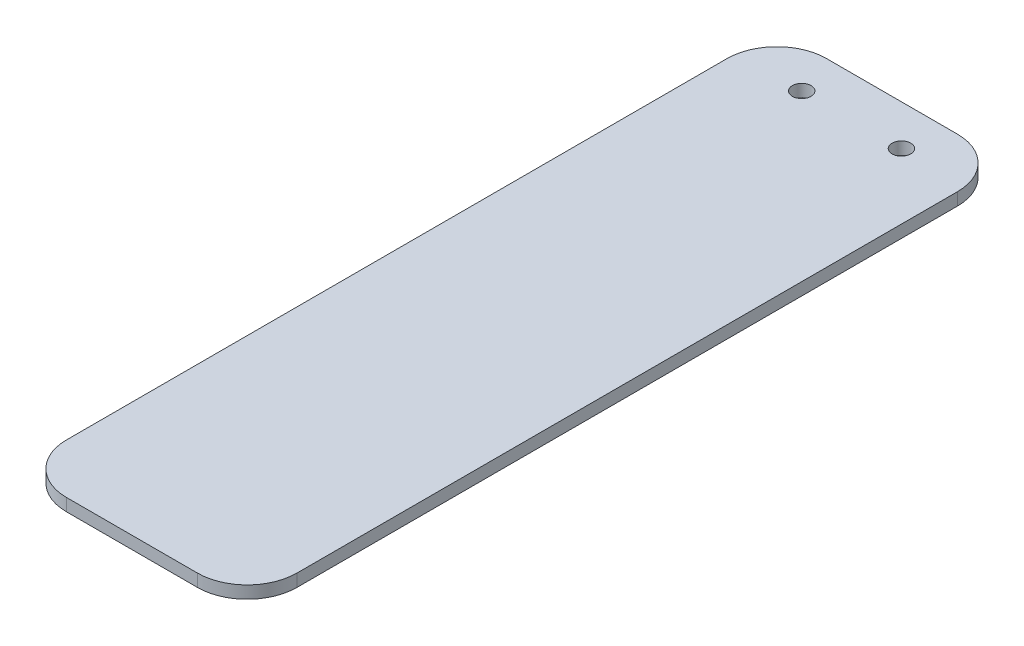
ISO-10303-21;
HEADER;
FILE_DESCRIPTION(('STEP AP214'),'2;1');
FILE_NAME('part.step','',(''),(''),'','','');
FILE_SCHEMA(('AUTOMOTIVE_DESIGN { 1 0 10303 214 1 1 1 1 }'));
ENDSEC;
DATA;
#1=APPLICATION_CONTEXT('core data for automotive mechanical design processes');
#2=APPLICATION_PROTOCOL_DEFINITION('international standard','automotive_design',2000,#1);
#3=PRODUCT_CONTEXT('',#1,'mechanical');
#4=PRODUCT('Part','Part','',(#3));
#5=PRODUCT_RELATED_PRODUCT_CATEGORY('part','',(#4));
#6=PRODUCT_DEFINITION_FORMATION('','',#4);
#7=PRODUCT_DEFINITION_CONTEXT('part definition',#1,'design');
#8=PRODUCT_DEFINITION('design','',#6,#7);
#9=PRODUCT_DEFINITION_SHAPE('','',#8);
#10=(LENGTH_UNIT() NAMED_UNIT(*) SI_UNIT(.MILLI.,.METRE.));
#11=(NAMED_UNIT(*) PLANE_ANGLE_UNIT() SI_UNIT($,.RADIAN.));
#12=(NAMED_UNIT(*) SI_UNIT($,.STERADIAN.) SOLID_ANGLE_UNIT());
#13=UNCERTAINTY_MEASURE_WITH_UNIT(LENGTH_MEASURE(1.E-05),#10,'distance_accuracy_value','');
#14=(GEOMETRIC_REPRESENTATION_CONTEXT(3) GLOBAL_UNCERTAINTY_ASSIGNED_CONTEXT((#13)) GLOBAL_UNIT_ASSIGNED_CONTEXT((#10,
#11,#12)) REPRESENTATION_CONTEXT('',''));
#15=CARTESIAN_POINT('',(0.,0.,0.));
#16=DIRECTION('',(0.,0.,1.));
#17=DIRECTION('',(1.,0.,0.));
#18=AXIS2_PLACEMENT_3D('',#15,#16,#17);
#19=CARTESIAN_POINT('',(8.,2.,-8.));
#20=DIRECTION('',(0.,-1.,0.));
#21=DIRECTION('',(0.,0.,-1.));
#22=AXIS2_PLACEMENT_3D('',#19,#20,#21);
#23=PLANE('',#22);
#24=CARTESIAN_POINT('',(8.,2.,-8.));
#25=DIRECTION('',(0.,1.,0.));
#26=DIRECTION('',(0.,0.,-1.));
#27=AXIS2_PLACEMENT_3D('',#24,#25,#26);
#28=CIRCLE('',#27,8.);
#29=CARTESIAN_POINT('',(0.,2.,-8.00000000000006));
#30=VERTEX_POINT('',#29);
#31=CARTESIAN_POINT('',(8.00000000000006,2.,0.));
#32=VERTEX_POINT('',#31);
#33=EDGE_CURVE('E170',#30,#32,#28,.T.);
#34=ORIENTED_EDGE('',*,*,#33,.T.);
#35=DIRECTION('',(1.,0.,0.));
#36=VECTOR('',#35,1.);
#37=CARTESIAN_POINT('',(8.00000000000006,2.,0.));
#38=LINE('',#37,#36);
#39=CARTESIAN_POINT('',(28.9999999999999,2.,0.));
#40=VERTEX_POINT('',#39);
#41=EDGE_CURVE('E106',#32,#40,#38,.T.);
#42=ORIENTED_EDGE('',*,*,#41,.T.);
#43=CARTESIAN_POINT('',(29.,2.,-8.));
#44=DIRECTION('',(0.,1.,0.));
#45=DIRECTION('',(0.,0.,1.));
#46=AXIS2_PLACEMENT_3D('',#43,#44,#45);
#47=CIRCLE('',#46,8.);
#48=CARTESIAN_POINT('',(37.,2.,-8.00000000000005));
#49=VERTEX_POINT('',#48);
#50=EDGE_CURVE('E191',#40,#49,#47,.T.);
#51=ORIENTED_EDGE('',*,*,#50,.T.);
#52=DIRECTION('',(0.,0.,-1.));
#53=VECTOR('',#52,1.);
#54=CARTESIAN_POINT('',(37.,2.,-8.00000000000006));
#55=LINE('',#54,#53);
#56=CARTESIAN_POINT('',(37.,2.,-114.));
#57=VERTEX_POINT('',#56);
#58=EDGE_CURVE('E205',#49,#57,#55,.T.);
#59=ORIENTED_EDGE('',*,*,#58,.T.);
#60=CARTESIAN_POINT('',(29.,2.,-114.));
#61=DIRECTION('',(0.,1.,0.));
#62=DIRECTION('',(0.,0.,-1.));
#63=AXIS2_PLACEMENT_3D('',#60,#61,#62);
#64=CIRCLE('',#63,8.);
#65=CARTESIAN_POINT('',(28.9999999999999,2.,-122.));
#66=VERTEX_POINT('',#65);
#67=EDGE_CURVE('E125',#57,#66,#64,.T.);
#68=ORIENTED_EDGE('',*,*,#67,.T.);
#69=DIRECTION('',(-1.,0.,0.));
#70=VECTOR('',#69,1.);
#71=CARTESIAN_POINT('',(8.00000000000006,2.,-122.));
#72=LINE('',#71,#70);
#73=CARTESIAN_POINT('',(8.00000000000006,2.,-122.));
#74=VERTEX_POINT('',#73);
#75=EDGE_CURVE('E119',#66,#74,#72,.T.);
#76=ORIENTED_EDGE('',*,*,#75,.T.);
#77=CARTESIAN_POINT('',(8.,2.,-114.));
#78=DIRECTION('',(0.,1.,0.));
#79=DIRECTION('',(0.,0.,-1.));
#80=AXIS2_PLACEMENT_3D('',#77,#78,#79);
#81=CIRCLE('',#80,8.);
#82=CARTESIAN_POINT('',(0.,2.,-114.));
#83=VERTEX_POINT('',#82);
#84=EDGE_CURVE('E123',#74,#83,#81,.T.);
#85=ORIENTED_EDGE('',*,*,#84,.T.);
#86=DIRECTION('',(0.,0.,1.));
#87=VECTOR('',#86,1.);
#88=CARTESIAN_POINT('',(0.,2.,-8.00000000000006));
#89=LINE('',#88,#87);
#90=EDGE_CURVE('E63',#83,#30,#89,.T.);
#91=ORIENTED_EDGE('',*,*,#90,.T.);
#92=EDGE_LOOP('',(#34,#42,#51,#59,#68,#76,#85,#91));
#93=FACE_BOUND('',#92,.T.);
#94=CARTESIAN_POINT('',(26.5,2.,-115.5));
#95=DIRECTION('',(0.,1.,0.));
#96=DIRECTION('',(0.,0.,1.));
#97=AXIS2_PLACEMENT_3D('',#94,#95,#96);
#98=CIRCLE('',#97,1.5);
#99=CARTESIAN_POINT('',(26.5,2.,-114.));
#100=VERTEX_POINT('',#99);
#101=EDGE_CURVE('E152',#100,#100,#98,.T.);
#102=ORIENTED_EDGE('',*,*,#101,.F.);
#103=EDGE_LOOP('',(#102));
#104=FACE_BOUND('',#103,.T.);
#105=CARTESIAN_POINT('',(10.5,2.,-115.5));
#106=DIRECTION('',(0.,1.,0.));
#107=DIRECTION('',(0.,0.,-1.));
#108=AXIS2_PLACEMENT_3D('',#105,#106,#107);
#109=CIRCLE('',#108,1.5);
#110=CARTESIAN_POINT('',(10.5,2.,-117.));
#111=VERTEX_POINT('',#110);
#112=EDGE_CURVE('E219',#111,#111,#109,.T.);
#113=ORIENTED_EDGE('',*,*,#112,.F.);
#114=EDGE_LOOP('',(#113));
#115=FACE_BOUND('',#114,.T.);
#116=ADVANCED_FACE('F45',(#93,#104,#115),#23,.F.);
#117=CARTESIAN_POINT('',(8.,0.,-8.));
#118=DIRECTION('',(0.,-1.,0.));
#119=DIRECTION('',(0.,0.,-1.));
#120=AXIS2_PLACEMENT_3D('',#117,#118,#119);
#121=PLANE('',#120);
#122=CARTESIAN_POINT('',(26.5,0.,-115.5));
#123=DIRECTION('',(0.,1.,0.));
#124=DIRECTION('',(0.,0.,1.));
#125=AXIS2_PLACEMENT_3D('',#122,#123,#124);
#126=CIRCLE('',#125,1.5);
#127=CARTESIAN_POINT('',(26.5,0.,-114.));
#128=VERTEX_POINT('',#127);
#129=EDGE_CURVE('E215',#128,#128,#126,.T.);
#130=ORIENTED_EDGE('',*,*,#129,.T.);
#131=EDGE_LOOP('',(#130));
#132=FACE_BOUND('',#131,.T.);
#133=CARTESIAN_POINT('',(8.,0.,-8.));
#134=DIRECTION('',(0.,1.,0.));
#135=DIRECTION('',(0.,0.,-1.));
#136=AXIS2_PLACEMENT_3D('',#133,#134,#135);
#137=CIRCLE('',#136,8.);
#138=CARTESIAN_POINT('',(0.,0.,-8.00000000000006));
#139=VERTEX_POINT('',#138);
#140=CARTESIAN_POINT('',(8.00000000000006,0.,0.));
#141=VERTEX_POINT('',#140);
#142=EDGE_CURVE('E147',#139,#141,#137,.T.);
#143=ORIENTED_EDGE('',*,*,#142,.F.);
#144=DIRECTION('',(0.,0.,1.));
#145=VECTOR('',#144,1.);
#146=CARTESIAN_POINT('',(0.,0.,-8.00000000000006));
#147=LINE('',#146,#145);
#148=CARTESIAN_POINT('',(0.,0.,-114.));
#149=VERTEX_POINT('',#148);
#150=EDGE_CURVE('E98',#149,#139,#147,.T.);
#151=ORIENTED_EDGE('',*,*,#150,.F.);
#152=CARTESIAN_POINT('',(8.,0.,-114.));
#153=DIRECTION('',(0.,1.,0.));
#154=DIRECTION('',(0.,0.,-1.));
#155=AXIS2_PLACEMENT_3D('',#152,#153,#154);
#156=CIRCLE('',#155,8.);
#157=CARTESIAN_POINT('',(8.00000000000006,0.,-122.));
#158=VERTEX_POINT('',#157);
#159=EDGE_CURVE('E92',#158,#149,#156,.T.);
#160=ORIENTED_EDGE('',*,*,#159,.F.);
#161=DIRECTION('',(-1.,0.,0.));
#162=VECTOR('',#161,1.);
#163=CARTESIAN_POINT('',(8.00000000000006,0.,-122.));
#164=LINE('',#163,#162);
#165=CARTESIAN_POINT('',(28.9999999999999,0.,-122.));
#166=VERTEX_POINT('',#165);
#167=EDGE_CURVE('E134',#166,#158,#164,.T.);
#168=ORIENTED_EDGE('',*,*,#167,.F.);
#169=CARTESIAN_POINT('',(29.,0.,-114.));
#170=DIRECTION('',(0.,1.,0.));
#171=DIRECTION('',(0.,0.,-1.));
#172=AXIS2_PLACEMENT_3D('',#169,#170,#171);
#173=CIRCLE('',#172,8.);
#174=CARTESIAN_POINT('',(37.,0.,-114.));
#175=VERTEX_POINT('',#174);
#176=EDGE_CURVE('E161',#175,#166,#173,.T.);
#177=ORIENTED_EDGE('',*,*,#176,.F.);
#178=DIRECTION('',(0.,0.,-1.));
#179=VECTOR('',#178,1.);
#180=CARTESIAN_POINT('',(37.,0.,-8.00000000000006));
#181=LINE('',#180,#179);
#182=CARTESIAN_POINT('',(37.,0.,-8.00000000000005));
#183=VERTEX_POINT('',#182);
#184=EDGE_CURVE('E158',#183,#175,#181,.T.);
#185=ORIENTED_EDGE('',*,*,#184,.F.);
#186=CARTESIAN_POINT('',(29.,0.,-8.));
#187=DIRECTION('',(0.,1.,0.));
#188=DIRECTION('',(0.,0.,1.));
#189=AXIS2_PLACEMENT_3D('',#186,#187,#188);
#190=CIRCLE('',#189,8.);
#191=CARTESIAN_POINT('',(28.9999999999999,0.,0.));
#192=VERTEX_POINT('',#191);
#193=EDGE_CURVE('E155',#192,#183,#190,.T.);
#194=ORIENTED_EDGE('',*,*,#193,.F.);
#195=DIRECTION('',(1.,0.,0.));
#196=VECTOR('',#195,1.);
#197=CARTESIAN_POINT('',(8.00000000000006,0.,0.));
#198=LINE('',#197,#196);
#199=EDGE_CURVE('E151',#141,#192,#198,.T.);
#200=ORIENTED_EDGE('',*,*,#199,.F.);
#201=EDGE_LOOP('',(#143,#151,#160,#168,#177,#185,#194,#200));
#202=FACE_BOUND('',#201,.T.);
#203=CARTESIAN_POINT('',(10.5,0.,-115.5));
#204=DIRECTION('',(0.,1.,0.));
#205=DIRECTION('',(0.,0.,-1.));
#206=AXIS2_PLACEMENT_3D('',#203,#204,#205);
#207=CIRCLE('',#206,1.5);
#208=CARTESIAN_POINT('',(10.5,0.,-117.));
#209=VERTEX_POINT('',#208);
#210=EDGE_CURVE('E223',#209,#209,#207,.T.);
#211=ORIENTED_EDGE('',*,*,#210,.T.);
#212=EDGE_LOOP('',(#211));
#213=FACE_BOUND('',#212,.T.);
#214=ADVANCED_FACE('F195',(#132,#202,#213),#121,.T.);
#215=CARTESIAN_POINT('',(8.,2.,-8.));
#216=DIRECTION('',(0.,-1.,0.));
#217=DIRECTION('',(0.,0.,-1.));
#218=AXIS2_PLACEMENT_3D('',#215,#216,#217);
#219=CYLINDRICAL_SURFACE('',#218,8.);
#220=ORIENTED_EDGE('',*,*,#142,.T.);
#221=DIRECTION('',(0.,-1.,0.));
#222=VECTOR('',#221,1.);
#223=CARTESIAN_POINT('',(8.00000000000006,2.,0.));
#224=LINE('',#223,#222);
#225=EDGE_CURVE('E11',#32,#141,#224,.T.);
#226=ORIENTED_EDGE('',*,*,#225,.F.);
#227=ORIENTED_EDGE('',*,*,#33,.F.);
#228=DIRECTION('',(0.,-1.,0.));
#229=VECTOR('',#228,1.);
#230=CARTESIAN_POINT('',(0.,2.,-8.00000000000006));
#231=LINE('',#230,#229);
#232=EDGE_CURVE('E143',#30,#139,#231,.T.);
#233=ORIENTED_EDGE('',*,*,#232,.T.);
#234=EDGE_LOOP('',(#220,#226,#227,#233));
#235=FACE_BOUND('',#234,.T.);
#236=ADVANCED_FACE('F47',(#235),#219,.T.);
#237=CARTESIAN_POINT('',(8.00000000000006,2.,0.));
#238=DIRECTION('',(0.,0.,-1.));
#239=DIRECTION('',(-1.,0.,0.));
#240=AXIS2_PLACEMENT_3D('',#237,#238,#239);
#241=PLANE('',#240);
#242=ORIENTED_EDGE('',*,*,#199,.T.);
#243=DIRECTION('',(0.,-1.,0.));
#244=VECTOR('',#243,1.);
#245=CARTESIAN_POINT('',(28.9999999999999,2.,0.));
#246=LINE('',#245,#244);
#247=EDGE_CURVE('E55',#40,#192,#246,.T.);
#248=ORIENTED_EDGE('',*,*,#247,.F.);
#249=ORIENTED_EDGE('',*,*,#41,.F.);
#250=ORIENTED_EDGE('',*,*,#225,.T.);
#251=EDGE_LOOP('',(#242,#248,#249,#250));
#252=FACE_BOUND('',#251,.T.);
#253=ADVANCED_FACE('F257',(#252),#241,.F.);
#254=CARTESIAN_POINT('',(29.,2.,-8.));
#255=DIRECTION('',(0.,-1.,0.));
#256=DIRECTION('',(0.,0.,-1.));
#257=AXIS2_PLACEMENT_3D('',#254,#255,#256);
#258=CYLINDRICAL_SURFACE('',#257,8.);
#259=ORIENTED_EDGE('',*,*,#193,.T.);
#260=DIRECTION('',(0.,-1.,0.));
#261=VECTOR('',#260,1.);
#262=CARTESIAN_POINT('',(37.,2.,-8.00000000000005));
#263=LINE('',#262,#261);
#264=EDGE_CURVE('E181',#49,#183,#263,.T.);
#265=ORIENTED_EDGE('',*,*,#264,.F.);
#266=ORIENTED_EDGE('',*,*,#50,.F.);
#267=ORIENTED_EDGE('',*,*,#247,.T.);
#268=EDGE_LOOP('',(#259,#265,#266,#267));
#269=FACE_BOUND('',#268,.T.);
#270=ADVANCED_FACE('F189',(#269),#258,.T.);
#271=CARTESIAN_POINT('',(37.,2.,-8.00000000000006));
#272=DIRECTION('',(-1.,0.,0.));
#273=DIRECTION('',(0.,0.,1.));
#274=AXIS2_PLACEMENT_3D('',#271,#272,#273);
#275=PLANE('',#274);
#276=ORIENTED_EDGE('',*,*,#184,.T.);
#277=DIRECTION('',(0.,-1.,0.));
#278=VECTOR('',#277,1.);
#279=CARTESIAN_POINT('',(37.,2.,-114.));
#280=LINE('',#279,#278);
#281=EDGE_CURVE('E177',#57,#175,#280,.T.);
#282=ORIENTED_EDGE('',*,*,#281,.F.);
#283=ORIENTED_EDGE('',*,*,#58,.F.);
#284=ORIENTED_EDGE('',*,*,#264,.T.);
#285=EDGE_LOOP('',(#276,#282,#283,#284));
#286=FACE_BOUND('',#285,.T.);
#287=ADVANCED_FACE('F200',(#286),#275,.F.);
#288=CARTESIAN_POINT('',(29.,2.,-114.));
#289=DIRECTION('',(0.,-1.,0.));
#290=DIRECTION('',(0.,0.,-1.));
#291=AXIS2_PLACEMENT_3D('',#288,#289,#290);
#292=CYLINDRICAL_SURFACE('',#291,8.);
#293=ORIENTED_EDGE('',*,*,#176,.T.);
#294=DIRECTION('',(0.,-1.,0.));
#295=VECTOR('',#294,1.);
#296=CARTESIAN_POINT('',(28.9999999999999,2.,-122.));
#297=LINE('',#296,#295);
#298=EDGE_CURVE('E136',#66,#166,#297,.T.);
#299=ORIENTED_EDGE('',*,*,#298,.F.);
#300=ORIENTED_EDGE('',*,*,#67,.F.);
#301=ORIENTED_EDGE('',*,*,#281,.T.);
#302=EDGE_LOOP('',(#293,#299,#300,#301));
#303=FACE_BOUND('',#302,.T.);
#304=ADVANCED_FACE('F203',(#303),#292,.T.);
#305=CARTESIAN_POINT('',(8.00000000000006,2.,-122.));
#306=DIRECTION('',(0.,0.,1.));
#307=DIRECTION('',(1.,0.,0.));
#308=AXIS2_PLACEMENT_3D('',#305,#306,#307);
#309=PLANE('',#308);
#310=ORIENTED_EDGE('',*,*,#167,.T.);
#311=DIRECTION('',(0.,-1.,0.));
#312=VECTOR('',#311,1.);
#313=CARTESIAN_POINT('',(8.00000000000006,2.,-122.));
#314=LINE('',#313,#312);
#315=EDGE_CURVE('E131',#74,#158,#314,.T.);
#316=ORIENTED_EDGE('',*,*,#315,.F.);
#317=ORIENTED_EDGE('',*,*,#75,.F.);
#318=ORIENTED_EDGE('',*,*,#298,.T.);
#319=EDGE_LOOP('',(#310,#316,#317,#318));
#320=FACE_BOUND('',#319,.T.);
#321=ADVANCED_FACE('F132',(#320),#309,.F.);
#322=CARTESIAN_POINT('',(8.,2.,-114.));
#323=DIRECTION('',(0.,-1.,0.));
#324=DIRECTION('',(0.,0.,-1.));
#325=AXIS2_PLACEMENT_3D('',#322,#323,#324);
#326=CYLINDRICAL_SURFACE('',#325,8.);
#327=ORIENTED_EDGE('',*,*,#159,.T.);
#328=DIRECTION('',(0.,-1.,0.));
#329=VECTOR('',#328,1.);
#330=CARTESIAN_POINT('',(0.,2.,-114.));
#331=LINE('',#330,#329);
#332=EDGE_CURVE('E137',#83,#149,#331,.T.);
#333=ORIENTED_EDGE('',*,*,#332,.F.);
#334=ORIENTED_EDGE('',*,*,#84,.F.);
#335=ORIENTED_EDGE('',*,*,#315,.T.);
#336=EDGE_LOOP('',(#327,#333,#334,#335));
#337=FACE_BOUND('',#336,.T.);
#338=ADVANCED_FACE('F139',(#337),#326,.T.);
#339=CARTESIAN_POINT('',(0.,2.,-8.00000000000006));
#340=DIRECTION('',(1.,0.,0.));
#341=DIRECTION('',(0.,0.,-1.));
#342=AXIS2_PLACEMENT_3D('',#339,#340,#341);
#343=PLANE('',#342);
#344=ORIENTED_EDGE('',*,*,#150,.T.);
#345=ORIENTED_EDGE('',*,*,#232,.F.);
#346=ORIENTED_EDGE('',*,*,#90,.F.);
#347=ORIENTED_EDGE('',*,*,#332,.T.);
#348=EDGE_LOOP('',(#344,#345,#346,#347));
#349=FACE_BOUND('',#348,.T.);
#350=ADVANCED_FACE('F245',(#349),#343,.F.);
#351=CARTESIAN_POINT('',(26.5,2.,-115.5));
#352=DIRECTION('',(0.,-1.,0.));
#353=DIRECTION('',(0.,0.,-1.));
#354=AXIS2_PLACEMENT_3D('',#351,#352,#353);
#355=CYLINDRICAL_SURFACE('',#354,1.5);
#356=ORIENTED_EDGE('',*,*,#101,.T.);
#357=EDGE_LOOP('',(#356));
#358=FACE_BOUND('',#357,.T.);
#359=ORIENTED_EDGE('',*,*,#129,.F.);
#360=EDGE_LOOP('',(#359));
#361=FACE_BOUND('',#360,.T.);
#362=ADVANCED_FACE('F242',(#358,#361),#355,.F.);
#363=CARTESIAN_POINT('',(10.5,2.,-115.5));
#364=DIRECTION('',(0.,-1.,0.));
#365=DIRECTION('',(0.,0.,-1.));
#366=AXIS2_PLACEMENT_3D('',#363,#364,#365);
#367=CYLINDRICAL_SURFACE('',#366,1.5);
#368=ORIENTED_EDGE('',*,*,#112,.T.);
#369=EDGE_LOOP('',(#368));
#370=FACE_BOUND('',#369,.T.);
#371=ORIENTED_EDGE('',*,*,#210,.F.);
#372=EDGE_LOOP('',(#371));
#373=FACE_BOUND('',#372,.T.);
#374=ADVANCED_FACE('F231',(#370,#373),#367,.F.);
#375=CLOSED_SHELL('',(#116,#214,#236,#253,#270,#287,#304,#321,#338,#350,#362,#374));
#376=MANIFOLD_SOLID_BREP('B2',#375);
#377=ADVANCED_BREP_SHAPE_REPRESENTATION('',(#18,#376),#14);
#378=SHAPE_DEFINITION_REPRESENTATION(#9,#377);
ENDSEC;
END-ISO-10303-21;
